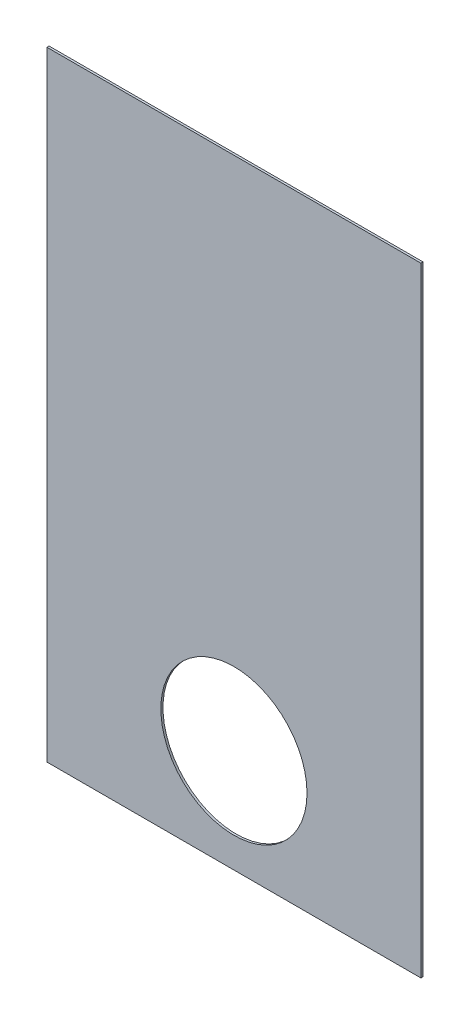
ISO-10303-21;
HEADER;
FILE_DESCRIPTION(('STEP AP214'),'2;1');
FILE_NAME('part.step','',(''),(''),'','','');
FILE_SCHEMA(('AUTOMOTIVE_DESIGN { 1 0 10303 214 1 1 1 1 }'));
ENDSEC;
DATA;
#1=APPLICATION_CONTEXT('core data for automotive mechanical design processes');
#2=APPLICATION_PROTOCOL_DEFINITION('international standard','automotive_design',2000,#1);
#3=PRODUCT_CONTEXT('',#1,'mechanical');
#4=PRODUCT('Part','Part','',(#3));
#5=PRODUCT_RELATED_PRODUCT_CATEGORY('part','',(#4));
#6=PRODUCT_DEFINITION_FORMATION('','',#4);
#7=PRODUCT_DEFINITION_CONTEXT('part definition',#1,'design');
#8=PRODUCT_DEFINITION('design','',#6,#7);
#9=PRODUCT_DEFINITION_SHAPE('','',#8);
#10=(LENGTH_UNIT() NAMED_UNIT(*) SI_UNIT(.MILLI.,.METRE.));
#11=(NAMED_UNIT(*) PLANE_ANGLE_UNIT() SI_UNIT($,.RADIAN.));
#12=(NAMED_UNIT(*) SI_UNIT($,.STERADIAN.) SOLID_ANGLE_UNIT());
#13=UNCERTAINTY_MEASURE_WITH_UNIT(LENGTH_MEASURE(1.E-05),#10,'distance_accuracy_value','');
#14=(GEOMETRIC_REPRESENTATION_CONTEXT(3) GLOBAL_UNCERTAINTY_ASSIGNED_CONTEXT((#13)) GLOBAL_UNIT_ASSIGNED_CONTEXT((#10,
#11,#12)) REPRESENTATION_CONTEXT('',''));
#15=CARTESIAN_POINT('',(0.,0.,0.));
#16=DIRECTION('',(0.,0.,1.));
#17=DIRECTION('',(1.,0.,0.));
#18=AXIS2_PLACEMENT_3D('',#15,#16,#17);
#19=CARTESIAN_POINT('',(276.225,457.2,3.175));
#20=DIRECTION('',(-1.,0.,0.));
#21=DIRECTION('',(0.,-1.,0.));
#22=AXIS2_PLACEMENT_3D('',#19,#20,#21);
#23=PLANE('',#22);
#24=DIRECTION('',(0.,1.,0.));
#25=VECTOR('',#24,1.);
#26=CARTESIAN_POINT('',(276.225,457.2,0.));
#27=LINE('',#26,#25);
#28=CARTESIAN_POINT('',(276.225,-457.2,0.));
#29=VERTEX_POINT('',#28);
#30=CARTESIAN_POINT('',(276.225,457.2,0.));
#31=VERTEX_POINT('',#30);
#32=EDGE_CURVE('E100',#29,#31,#27,.T.);
#33=ORIENTED_EDGE('',*,*,#32,.T.);
#34=DIRECTION('',(0.,0.,-1.));
#35=VECTOR('',#34,1.);
#36=CARTESIAN_POINT('',(276.225,457.2,3.175));
#37=LINE('',#36,#35);
#38=CARTESIAN_POINT('',(276.225,457.2,3.175));
#39=VERTEX_POINT('',#38);
#40=EDGE_CURVE('E11',#39,#31,#37,.T.);
#41=ORIENTED_EDGE('',*,*,#40,.F.);
#42=DIRECTION('',(0.,1.,0.));
#43=VECTOR('',#42,1.);
#44=CARTESIAN_POINT('',(276.225,457.2,3.175));
#45=LINE('',#44,#43);
#46=CARTESIAN_POINT('',(276.225,-457.2,3.175));
#47=VERTEX_POINT('',#46);
#48=EDGE_CURVE('E87',#47,#39,#45,.T.);
#49=ORIENTED_EDGE('',*,*,#48,.F.);
#50=DIRECTION('',(0.,0.,-1.));
#51=VECTOR('',#50,1.);
#52=CARTESIAN_POINT('',(276.225,-457.2,3.175));
#53=LINE('',#52,#51);
#54=EDGE_CURVE('E96',#47,#29,#53,.T.);
#55=ORIENTED_EDGE('',*,*,#54,.T.);
#56=EDGE_LOOP('',(#33,#41,#49,#55));
#57=FACE_BOUND('',#56,.T.);
#58=ADVANCED_FACE('F35',(#57),#23,.F.);
#59=CARTESIAN_POINT('',(-276.225,457.2,3.175));
#60=DIRECTION('',(0.,-1.,0.));
#61=DIRECTION('',(1.,0.,0.));
#62=AXIS2_PLACEMENT_3D('',#59,#60,#61);
#63=PLANE('',#62);
#64=DIRECTION('',(-1.,0.,0.));
#65=VECTOR('',#64,1.);
#66=CARTESIAN_POINT('',(-276.225,457.2,0.));
#67=LINE('',#66,#65);
#68=CARTESIAN_POINT('',(-276.225,457.2,0.));
#69=VERTEX_POINT('',#68);
#70=EDGE_CURVE('E91',#31,#69,#67,.T.);
#71=ORIENTED_EDGE('',*,*,#70,.T.);
#72=DIRECTION('',(0.,0.,-1.));
#73=VECTOR('',#72,1.);
#74=CARTESIAN_POINT('',(-276.225,457.2,3.175));
#75=LINE('',#74,#73);
#76=CARTESIAN_POINT('',(-276.225,457.2,3.175));
#77=VERTEX_POINT('',#76);
#78=EDGE_CURVE('E44',#77,#69,#75,.T.);
#79=ORIENTED_EDGE('',*,*,#78,.F.);
#80=DIRECTION('',(-1.,0.,0.));
#81=VECTOR('',#80,1.);
#82=CARTESIAN_POINT('',(-276.225,457.2,3.175));
#83=LINE('',#82,#81);
#84=EDGE_CURVE('E82',#39,#77,#83,.T.);
#85=ORIENTED_EDGE('',*,*,#84,.F.);
#86=ORIENTED_EDGE('',*,*,#40,.T.);
#87=EDGE_LOOP('',(#71,#79,#85,#86));
#88=FACE_BOUND('',#87,.T.);
#89=ADVANCED_FACE('F90',(#88),#63,.F.);
#90=CARTESIAN_POINT('',(-276.225,457.2,3.175));
#91=DIRECTION('',(1.,0.,0.));
#92=DIRECTION('',(0.,1.,0.));
#93=AXIS2_PLACEMENT_3D('',#90,#91,#92);
#94=PLANE('',#93);
#95=DIRECTION('',(0.,-1.,0.));
#96=VECTOR('',#95,1.);
#97=CARTESIAN_POINT('',(-276.225,457.2,0.));
#98=LINE('',#97,#96);
#99=CARTESIAN_POINT('',(-276.225,-457.2,0.));
#100=VERTEX_POINT('',#99);
#101=EDGE_CURVE('E69',#69,#100,#98,.T.);
#102=ORIENTED_EDGE('',*,*,#101,.T.);
#103=DIRECTION('',(0.,0.,-1.));
#104=VECTOR('',#103,1.);
#105=CARTESIAN_POINT('',(-276.225,-457.2,3.175));
#106=LINE('',#105,#104);
#107=CARTESIAN_POINT('',(-276.225,-457.2,3.175));
#108=VERTEX_POINT('',#107);
#109=EDGE_CURVE('E92',#108,#100,#106,.T.);
#110=ORIENTED_EDGE('',*,*,#109,.F.);
#111=DIRECTION('',(0.,-1.,0.));
#112=VECTOR('',#111,1.);
#113=CARTESIAN_POINT('',(-276.225,457.2,3.175));
#114=LINE('',#113,#112);
#115=EDGE_CURVE('E85',#77,#108,#114,.T.);
#116=ORIENTED_EDGE('',*,*,#115,.F.);
#117=ORIENTED_EDGE('',*,*,#78,.T.);
#118=EDGE_LOOP('',(#102,#110,#116,#117));
#119=FACE_BOUND('',#118,.T.);
#120=ADVANCED_FACE('F94',(#119),#94,.F.);
#121=CARTESIAN_POINT('',(-276.225,-457.2,3.175));
#122=DIRECTION('',(0.,1.,0.));
#123=DIRECTION('',(0.,0.,1.));
#124=AXIS2_PLACEMENT_3D('',#121,#122,#123);
#125=PLANE('',#124);
#126=DIRECTION('',(1.,0.,0.));
#127=VECTOR('',#126,1.);
#128=CARTESIAN_POINT('',(-276.225,-457.2,0.));
#129=LINE('',#128,#127);
#130=EDGE_CURVE('E75',#100,#29,#129,.T.);
#131=ORIENTED_EDGE('',*,*,#130,.T.);
#132=ORIENTED_EDGE('',*,*,#54,.F.);
#133=DIRECTION('',(1.,0.,0.));
#134=VECTOR('',#133,1.);
#135=CARTESIAN_POINT('',(-276.225,-457.2,3.175));
#136=LINE('',#135,#134);
#137=EDGE_CURVE('E52',#108,#47,#136,.T.);
#138=ORIENTED_EDGE('',*,*,#137,.F.);
#139=ORIENTED_EDGE('',*,*,#109,.T.);
#140=EDGE_LOOP('',(#131,#132,#138,#139));
#141=FACE_BOUND('',#140,.T.);
#142=ADVANCED_FACE('F107',(#141),#125,.F.);
#143=CARTESIAN_POINT('',(0.,0.,3.175));
#144=DIRECTION('',(0.,0.,1.));
#145=DIRECTION('',(1.,0.,0.));
#146=AXIS2_PLACEMENT_3D('',#143,#144,#145);
#147=PLANE('',#146);
#148=CARTESIAN_POINT('',(0.,-304.8,3.175));
#149=DIRECTION('',(0.,0.,1.));
#150=DIRECTION('',(1.,0.,0.));
#151=AXIS2_PLACEMENT_3D('',#148,#149,#150);
#152=CIRCLE('',#151,107.95);
#153=CARTESIAN_POINT('',(107.95,-304.8,3.175));
#154=VERTEX_POINT('',#153);
#155=EDGE_CURVE('E113',#154,#154,#152,.T.);
#156=ORIENTED_EDGE('',*,*,#155,.F.);
#157=EDGE_LOOP('',(#156));
#158=FACE_BOUND('',#157,.T.);
#159=ORIENTED_EDGE('',*,*,#48,.T.);
#160=ORIENTED_EDGE('',*,*,#84,.T.);
#161=ORIENTED_EDGE('',*,*,#115,.T.);
#162=ORIENTED_EDGE('',*,*,#137,.T.);
#163=EDGE_LOOP('',(#159,#160,#161,#162));
#164=FACE_BOUND('',#163,.T.);
#165=ADVANCED_FACE('F83',(#158,#164),#147,.T.);
#166=CARTESIAN_POINT('',(0.,0.,0.));
#167=DIRECTION('',(0.,0.,1.));
#168=DIRECTION('',(1.,0.,0.));
#169=AXIS2_PLACEMENT_3D('',#166,#167,#168);
#170=PLANE('',#169);
#171=CARTESIAN_POINT('',(0.,-304.8,0.));
#172=DIRECTION('',(0.,0.,1.));
#173=DIRECTION('',(1.,0.,0.));
#174=AXIS2_PLACEMENT_3D('',#171,#172,#173);
#175=CIRCLE('',#174,107.95);
#176=CARTESIAN_POINT('',(107.95,-304.8,0.));
#177=VERTEX_POINT('',#176);
#178=EDGE_CURVE('E38',#177,#177,#175,.T.);
#179=ORIENTED_EDGE('',*,*,#178,.T.);
#180=EDGE_LOOP('',(#179));
#181=FACE_BOUND('',#180,.T.);
#182=ORIENTED_EDGE('',*,*,#32,.F.);
#183=ORIENTED_EDGE('',*,*,#130,.F.);
#184=ORIENTED_EDGE('',*,*,#101,.F.);
#185=ORIENTED_EDGE('',*,*,#70,.F.);
#186=EDGE_LOOP('',(#182,#183,#184,#185));
#187=FACE_BOUND('',#186,.T.);
#188=ADVANCED_FACE('F110',(#181,#187),#170,.F.);
#189=CARTESIAN_POINT('',(0.,-304.8,-1.905));
#190=DIRECTION('',(0.,0.,1.));
#191=DIRECTION('',(1.,0.,0.));
#192=AXIS2_PLACEMENT_3D('',#189,#190,#191);
#193=CYLINDRICAL_SURFACE('',#192,107.95);
#194=ORIENTED_EDGE('',*,*,#155,.T.);
#195=EDGE_LOOP('',(#194));
#196=FACE_BOUND('',#195,.T.);
#197=ORIENTED_EDGE('',*,*,#178,.F.);
#198=EDGE_LOOP('',(#197));
#199=FACE_BOUND('',#198,.T.);
#200=ADVANCED_FACE('F121',(#196,#199),#193,.F.);
#201=CLOSED_SHELL('',(#58,#89,#120,#142,#165,#188,#200));
#202=MANIFOLD_SOLID_BREP('B2',#201);
#203=ADVANCED_BREP_SHAPE_REPRESENTATION('',(#18,#202),#14);
#204=SHAPE_DEFINITION_REPRESENTATION(#9,#203);
ENDSEC;
END-ISO-10303-21;
